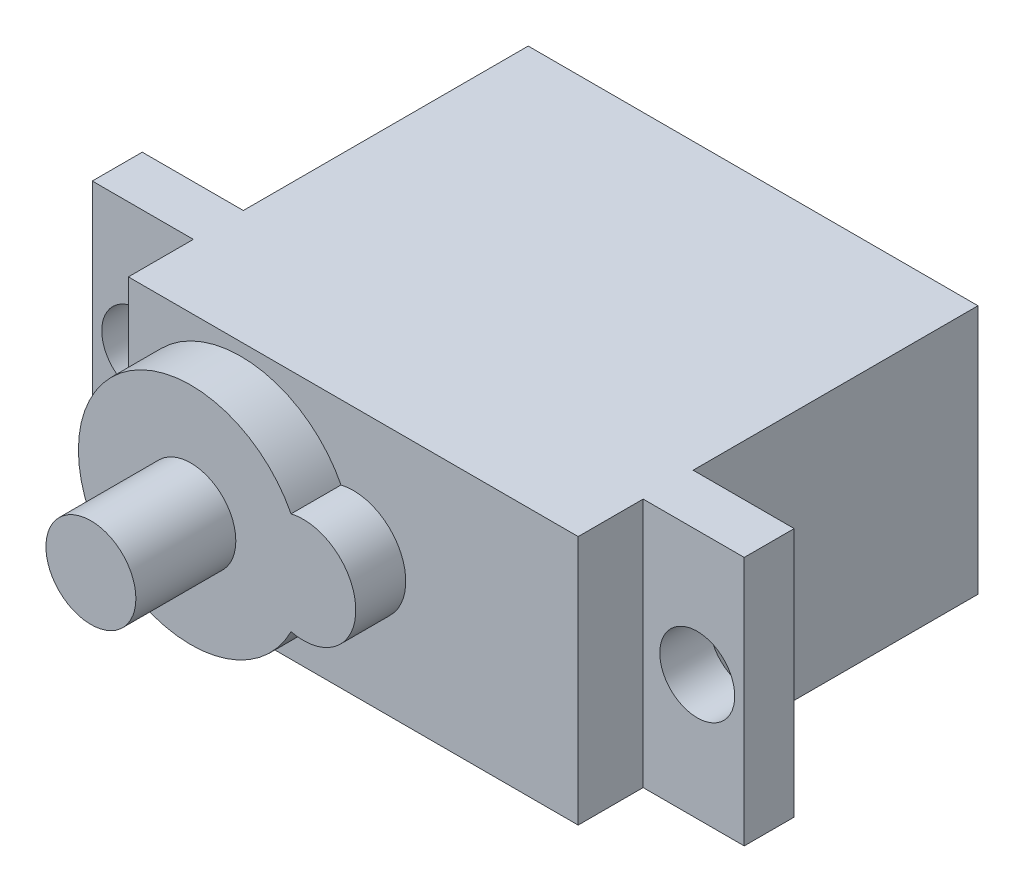
ISO-10303-21;
HEADER;
FILE_DESCRIPTION(('STEP AP214'),'2;1');
FILE_NAME('part.step','',(''),(''),'','','');
FILE_SCHEMA(('AUTOMOTIVE_DESIGN { 1 0 10303 214 1 1 1 1 }'));
ENDSEC;
DATA;
#1=APPLICATION_CONTEXT('core data for automotive mechanical design processes');
#2=APPLICATION_PROTOCOL_DEFINITION('international standard','automotive_design',2000,#1);
#3=PRODUCT_CONTEXT('',#1,'mechanical');
#4=PRODUCT('Part','Part','',(#3));
#5=PRODUCT_RELATED_PRODUCT_CATEGORY('part','',(#4));
#6=PRODUCT_DEFINITION_FORMATION('','',#4);
#7=PRODUCT_DEFINITION_CONTEXT('part definition',#1,'design');
#8=PRODUCT_DEFINITION('design','',#6,#7);
#9=PRODUCT_DEFINITION_SHAPE('','',#8);
#10=(LENGTH_UNIT() NAMED_UNIT(*) SI_UNIT(.MILLI.,.METRE.));
#11=(NAMED_UNIT(*) PLANE_ANGLE_UNIT() SI_UNIT($,.RADIAN.));
#12=(NAMED_UNIT(*) SI_UNIT($,.STERADIAN.) SOLID_ANGLE_UNIT());
#13=UNCERTAINTY_MEASURE_WITH_UNIT(LENGTH_MEASURE(1.E-05),#10,'distance_accuracy_value','');
#14=(GEOMETRIC_REPRESENTATION_CONTEXT(3) GLOBAL_UNCERTAINTY_ASSIGNED_CONTEXT((#13)) GLOBAL_UNIT_ASSIGNED_CONTEXT((#10,
#11,#12)) REPRESENTATION_CONTEXT('',''));
#15=CARTESIAN_POINT('',(0.,0.,0.));
#16=DIRECTION('',(0.,0.,1.));
#17=DIRECTION('',(1.,0.,0.));
#18=AXIS2_PLACEMENT_3D('',#15,#16,#17);
#19=CARTESIAN_POINT('',(-92.7307385808718,0.,-17.018));
#20=DIRECTION('',(-1.,0.,0.));
#21=DIRECTION('',(0.,0.,1.));
#22=AXIS2_PLACEMENT_3D('',#19,#20,#21);
#23=PLANE('',#22);
#24=DIRECTION('',(0.,0.,1.));
#25=VECTOR('',#24,1.);
#26=CARTESIAN_POINT('',(-92.7307385808718,67.2823387554157,-17.018));
#27=LINE('',#26,#25);
#28=CARTESIAN_POINT('',(-92.7307385808718,67.2823387554157,0.));
#29=VERTEX_POINT('',#28);
#30=CARTESIAN_POINT('',(-92.7307385808718,67.2823387554157,3.302));
#31=VERTEX_POINT('',#30);
#32=EDGE_CURVE('E257',#29,#31,#27,.T.);
#33=ORIENTED_EDGE('',*,*,#32,.F.);
#34=DIRECTION('',(0.,-1.,0.));
#35=VECTOR('',#34,1.);
#36=CARTESIAN_POINT('',(-92.7307385808718,0.,0.));
#37=LINE('',#36,#35);
#38=CARTESIAN_POINT('',(-92.7307385808718,54.5823387554157,0.));
#39=VERTEX_POINT('',#38);
#40=EDGE_CURVE('E176',#29,#39,#37,.T.);
#41=ORIENTED_EDGE('',*,*,#40,.T.);
#42=DIRECTION('',(0.,0.,1.));
#43=VECTOR('',#42,1.);
#44=CARTESIAN_POINT('',(-92.7307385808718,54.5823387554157,-17.018));
#45=LINE('',#44,#43);
#46=CARTESIAN_POINT('',(-92.7307385808718,54.5823387554157,3.302));
#47=VERTEX_POINT('',#46);
#48=EDGE_CURVE('E265',#39,#47,#45,.T.);
#49=ORIENTED_EDGE('',*,*,#48,.T.);
#50=DIRECTION('',(0.,-1.,0.));
#51=VECTOR('',#50,1.);
#52=CARTESIAN_POINT('',(-92.7307385808718,0.,3.302));
#53=LINE('',#52,#51);
#54=CARTESIAN_POINT('',(-92.7307385808718,60.9323387554157,3.302));
#55=VERTEX_POINT('',#54);
#56=EDGE_CURVE('E237',#55,#47,#53,.T.);
#57=ORIENTED_EDGE('',*,*,#56,.F.);
#58=EDGE_CURVE('E238',#31,#55,#53,.T.);
#59=ORIENTED_EDGE('',*,*,#58,.F.);
#60=EDGE_LOOP('',(#33,#41,#49,#57,#59));
#61=FACE_BOUND('',#60,.T.);
#62=ADVANCED_FACE('F45',(#61),#23,.T.);
#63=CARTESIAN_POINT('',(-69.8707385808718,0.,-17.018));
#64=DIRECTION('',(-1.,0.,0.));
#65=DIRECTION('',(0.,0.,1.));
#66=AXIS2_PLACEMENT_3D('',#63,#64,#65);
#67=PLANE('',#66);
#68=DIRECTION('',(0.,-1.,0.));
#69=VECTOR('',#68,1.);
#70=CARTESIAN_POINT('',(-69.8707385808718,0.,0.));
#71=LINE('',#70,#69);
#72=CARTESIAN_POINT('',(-69.8707385808718,67.2823387554157,0.));
#73=VERTEX_POINT('',#72);
#74=CARTESIAN_POINT('',(-69.8707385808718,54.5823387554157,0.));
#75=VERTEX_POINT('',#74);
#76=EDGE_CURVE('E219',#73,#75,#71,.T.);
#77=ORIENTED_EDGE('',*,*,#76,.F.);
#78=DIRECTION('',(0.,0.,1.));
#79=VECTOR('',#78,1.);
#80=CARTESIAN_POINT('',(-69.8707385808718,67.2823387554157,-17.018));
#81=LINE('',#80,#79);
#82=CARTESIAN_POINT('',(-69.8707385808718,67.2823387554157,3.302));
#83=VERTEX_POINT('',#82);
#84=EDGE_CURVE('E260',#73,#83,#81,.T.);
#85=ORIENTED_EDGE('',*,*,#84,.T.);
#86=DIRECTION('',(0.,-1.,0.));
#87=VECTOR('',#86,1.);
#88=CARTESIAN_POINT('',(-69.8707385808718,0.,3.302));
#89=LINE('',#88,#87);
#90=CARTESIAN_POINT('',(-69.8707385808718,54.5823387554157,3.302));
#91=VERTEX_POINT('',#90);
#92=EDGE_CURVE('E243',#83,#91,#89,.T.);
#93=ORIENTED_EDGE('',*,*,#92,.T.);
#94=DIRECTION('',(0.,0.,1.));
#95=VECTOR('',#94,1.);
#96=CARTESIAN_POINT('',(-69.8707385808718,54.5823387554157,-17.018));
#97=LINE('',#96,#95);
#98=EDGE_CURVE('E263',#75,#91,#97,.T.);
#99=ORIENTED_EDGE('',*,*,#98,.F.);
#100=EDGE_LOOP('',(#77,#85,#93,#99));
#101=FACE_BOUND('',#100,.T.);
#102=ADVANCED_FACE('F286',(#101),#67,.F.);
#103=CARTESIAN_POINT('',(0.,67.2823387554157,-17.018));
#104=DIRECTION('',(0.,-1.,0.));
#105=DIRECTION('',(0.,0.,-1.));
#106=AXIS2_PLACEMENT_3D('',#103,#104,#105);
#107=PLANE('',#106);
#108=CARTESIAN_POINT('',(-92.7307385808718,67.2823387554157,-17.018));
#109=VERTEX_POINT('',#108);
#110=CARTESIAN_POINT('',(-92.7307385808718,67.2823387554157,-2.54));
#111=VERTEX_POINT('',#110);
#112=EDGE_CURVE('E49',#109,#111,#27,.T.);
#113=ORIENTED_EDGE('',*,*,#112,.T.);
#114=DIRECTION('',(-1.,0.,0.));
#115=VECTOR('',#114,1.);
#116=CARTESIAN_POINT('',(0.,67.2823387554157,-2.54));
#117=LINE('',#116,#115);
#118=CARTESIAN_POINT('',(-97.8676638737466,67.2823387554157,-2.54));
#119=VERTEX_POINT('',#118);
#120=EDGE_CURVE('E175',#111,#119,#117,.T.);
#121=ORIENTED_EDGE('',*,*,#120,.T.);
#122=DIRECTION('',(0.,0.,1.));
#123=VECTOR('',#122,1.);
#124=CARTESIAN_POINT('',(-97.8676638737466,67.2823387554157,-2.54));
#125=LINE('',#124,#123);
#126=CARTESIAN_POINT('',(-97.8676638737466,67.2823387554157,0.));
#127=VERTEX_POINT('',#126);
#128=EDGE_CURVE('E186',#119,#127,#125,.T.);
#129=ORIENTED_EDGE('',*,*,#128,.T.);
#130=DIRECTION('',(-1.,0.,0.));
#131=VECTOR('',#130,1.);
#132=CARTESIAN_POINT('',(0.,67.2823387554157,0.));
#133=LINE('',#132,#131);
#134=EDGE_CURVE('E168',#29,#127,#133,.T.);
#135=ORIENTED_EDGE('',*,*,#134,.F.);
#136=ORIENTED_EDGE('',*,*,#32,.T.);
#137=DIRECTION('',(1.,0.,0.));
#138=VECTOR('',#137,1.);
#139=CARTESIAN_POINT('',(0.,67.2823387554157,3.302));
#140=LINE('',#139,#138);
#141=EDGE_CURVE('E233',#31,#83,#140,.T.);
#142=ORIENTED_EDGE('',*,*,#141,.T.);
#143=ORIENTED_EDGE('',*,*,#84,.F.);
#144=DIRECTION('',(1.,0.,0.));
#145=VECTOR('',#144,1.);
#146=CARTESIAN_POINT('',(0.,67.2823387554157,0.));
#147=LINE('',#146,#145);
#148=CARTESIAN_POINT('',(-64.733813287997,67.2823387554157,0.));
#149=VERTEX_POINT('',#148);
#150=EDGE_CURVE('E199',#73,#149,#147,.T.);
#151=ORIENTED_EDGE('',*,*,#150,.T.);
#152=DIRECTION('',(0.,0.,1.));
#153=VECTOR('',#152,1.);
#154=CARTESIAN_POINT('',(-64.733813287997,67.2823387554157,-2.54));
#155=LINE('',#154,#153);
#156=CARTESIAN_POINT('',(-64.733813287997,67.2823387554157,-2.54));
#157=VERTEX_POINT('',#156);
#158=EDGE_CURVE('E230',#157,#149,#155,.T.);
#159=ORIENTED_EDGE('',*,*,#158,.F.);
#160=DIRECTION('',(1.,0.,0.));
#161=VECTOR('',#160,1.);
#162=CARTESIAN_POINT('',(0.,67.2823387554157,-2.54));
#163=LINE('',#162,#161);
#164=CARTESIAN_POINT('',(-69.8707385808718,67.2823387554157,-2.54));
#165=VERTEX_POINT('',#164);
#166=EDGE_CURVE('E201',#165,#157,#163,.T.);
#167=ORIENTED_EDGE('',*,*,#166,.F.);
#168=CARTESIAN_POINT('',(-69.8707385808718,67.2823387554157,-17.018));
#169=VERTEX_POINT('',#168);
#170=EDGE_CURVE('E54',#169,#165,#81,.T.);
#171=ORIENTED_EDGE('',*,*,#170,.F.);
#172=DIRECTION('',(1.,0.,0.));
#173=VECTOR('',#172,1.);
#174=CARTESIAN_POINT('',(0.,67.2823387554157,-17.018));
#175=LINE('',#174,#173);
#176=EDGE_CURVE('E246',#109,#169,#175,.T.);
#177=ORIENTED_EDGE('',*,*,#176,.F.);
#178=EDGE_LOOP('',(#113,#121,#129,#135,#136,#142,#143,#151,#159,#167,#171,#177));
#179=FACE_BOUND('',#178,.T.);
#180=ADVANCED_FACE('F47',(#179),#107,.F.);
#181=ORIENTED_EDGE('',*,*,#170,.T.);
#182=DIRECTION('',(0.,-1.,0.));
#183=VECTOR('',#182,1.);
#184=CARTESIAN_POINT('',(-69.8707385808718,0.,-2.54));
#185=LINE('',#184,#183);
#186=CARTESIAN_POINT('',(-69.8707385808718,54.5823387554157,-2.54));
#187=VERTEX_POINT('',#186);
#188=EDGE_CURVE('E204',#165,#187,#185,.T.);
#189=ORIENTED_EDGE('',*,*,#188,.T.);
#190=CARTESIAN_POINT('',(-69.8707385808718,54.5823387554157,-17.018));
#191=VERTEX_POINT('',#190);
#192=EDGE_CURVE('E261',#191,#187,#97,.T.);
#193=ORIENTED_EDGE('',*,*,#192,.F.);
#194=DIRECTION('',(0.,-1.,0.));
#195=VECTOR('',#194,1.);
#196=CARTESIAN_POINT('',(-69.8707385808718,0.,-17.018));
#197=LINE('',#196,#195);
#198=EDGE_CURVE('E255',#169,#191,#197,.T.);
#199=ORIENTED_EDGE('',*,*,#198,.F.);
#200=EDGE_LOOP('',(#181,#189,#193,#199));
#201=FACE_BOUND('',#200,.T.);
#202=ADVANCED_FACE('F301',(#201),#67,.F.);
#203=CARTESIAN_POINT('',(0.,54.5823387554157,-17.018));
#204=DIRECTION('',(0.,-1.,0.));
#205=DIRECTION('',(0.,0.,-1.));
#206=AXIS2_PLACEMENT_3D('',#203,#204,#205);
#207=PLANE('',#206);
#208=ORIENTED_EDGE('',*,*,#192,.T.);
#209=DIRECTION('',(1.,0.,0.));
#210=VECTOR('',#209,1.);
#211=CARTESIAN_POINT('',(0.,54.5823387554157,-2.54));
#212=LINE('',#211,#210);
#213=CARTESIAN_POINT('',(-64.733813287997,54.5823387554157,-2.54));
#214=VERTEX_POINT('',#213);
#215=EDGE_CURVE('E208',#187,#214,#212,.T.);
#216=ORIENTED_EDGE('',*,*,#215,.T.);
#217=DIRECTION('',(0.,0.,1.));
#218=VECTOR('',#217,1.);
#219=CARTESIAN_POINT('',(-64.733813287997,54.5823387554157,-2.54));
#220=LINE('',#219,#218);
#221=CARTESIAN_POINT('',(-64.733813287997,54.5823387554157,0.));
#222=VERTEX_POINT('',#221);
#223=EDGE_CURVE('E216',#214,#222,#220,.T.);
#224=ORIENTED_EDGE('',*,*,#223,.T.);
#225=DIRECTION('',(1.,0.,0.));
#226=VECTOR('',#225,1.);
#227=CARTESIAN_POINT('',(0.,54.5823387554157,0.));
#228=LINE('',#227,#226);
#229=EDGE_CURVE('E222',#75,#222,#228,.T.);
#230=ORIENTED_EDGE('',*,*,#229,.F.);
#231=ORIENTED_EDGE('',*,*,#98,.T.);
#232=DIRECTION('',(1.,0.,0.));
#233=VECTOR('',#232,1.);
#234=CARTESIAN_POINT('',(0.,54.5823387554157,3.302));
#235=LINE('',#234,#233);
#236=EDGE_CURVE('E240',#47,#91,#235,.T.);
#237=ORIENTED_EDGE('',*,*,#236,.F.);
#238=ORIENTED_EDGE('',*,*,#48,.F.);
#239=DIRECTION('',(-1.,0.,0.));
#240=VECTOR('',#239,1.);
#241=CARTESIAN_POINT('',(0.,54.5823387554157,0.));
#242=LINE('',#241,#240);
#243=CARTESIAN_POINT('',(-97.8676638737466,54.5823387554157,0.));
#244=VERTEX_POINT('',#243);
#245=EDGE_CURVE('E193',#39,#244,#242,.T.);
#246=ORIENTED_EDGE('',*,*,#245,.T.);
#247=DIRECTION('',(0.,0.,1.));
#248=VECTOR('',#247,1.);
#249=CARTESIAN_POINT('',(-97.8676638737466,54.5823387554157,-2.54));
#250=LINE('',#249,#248);
#251=CARTESIAN_POINT('',(-97.8676638737466,54.5823387554157,-2.54));
#252=VERTEX_POINT('',#251);
#253=EDGE_CURVE('E197',#252,#244,#250,.T.);
#254=ORIENTED_EDGE('',*,*,#253,.F.);
#255=DIRECTION('',(-1.,0.,0.));
#256=VECTOR('',#255,1.);
#257=CARTESIAN_POINT('',(0.,54.5823387554157,-2.54));
#258=LINE('',#257,#256);
#259=CARTESIAN_POINT('',(-92.7307385808718,54.5823387554157,-2.54));
#260=VERTEX_POINT('',#259);
#261=EDGE_CURVE('E182',#260,#252,#258,.T.);
#262=ORIENTED_EDGE('',*,*,#261,.F.);
#263=CARTESIAN_POINT('',(-92.7307385808718,54.5823387554157,-17.018));
#264=VERTEX_POINT('',#263);
#265=EDGE_CURVE('E264',#264,#260,#45,.T.);
#266=ORIENTED_EDGE('',*,*,#265,.F.);
#267=DIRECTION('',(1.,0.,0.));
#268=VECTOR('',#267,1.);
#269=CARTESIAN_POINT('',(0.,54.5823387554157,-17.018));
#270=LINE('',#269,#268);
#271=EDGE_CURVE('E252',#264,#191,#270,.T.);
#272=ORIENTED_EDGE('',*,*,#271,.T.);
#273=EDGE_LOOP('',(#208,#216,#224,#230,#231,#237,#238,#246,#254,#262,#266,#272));
#274=FACE_BOUND('',#273,.T.);
#275=ADVANCED_FACE('F318',(#274),#207,.T.);
#276=DIRECTION('',(0.,-1.,0.));
#277=VECTOR('',#276,1.);
#278=CARTESIAN_POINT('',(-92.7307385808718,0.,-2.54));
#279=LINE('',#278,#277);
#280=EDGE_CURVE('E184',#111,#260,#279,.T.);
#281=ORIENTED_EDGE('',*,*,#280,.F.);
#282=ORIENTED_EDGE('',*,*,#112,.F.);
#283=DIRECTION('',(0.,-1.,0.));
#284=VECTOR('',#283,1.);
#285=CARTESIAN_POINT('',(-92.7307385808718,0.,-17.018));
#286=LINE('',#285,#284);
#287=EDGE_CURVE('E249',#109,#264,#286,.T.);
#288=ORIENTED_EDGE('',*,*,#287,.T.);
#289=ORIENTED_EDGE('',*,*,#265,.T.);
#290=EDGE_LOOP('',(#281,#282,#288,#289));
#291=FACE_BOUND('',#290,.T.);
#292=ADVANCED_FACE('F306',(#291),#23,.T.);
#293=CARTESIAN_POINT('',(0.,0.,-17.018));
#294=DIRECTION('',(0.,0.,1.));
#295=DIRECTION('',(1.,0.,0.));
#296=AXIS2_PLACEMENT_3D('',#293,#294,#295);
#297=PLANE('',#296);
#298=ORIENTED_EDGE('',*,*,#176,.T.);
#299=ORIENTED_EDGE('',*,*,#198,.T.);
#300=ORIENTED_EDGE('',*,*,#271,.F.);
#301=ORIENTED_EDGE('',*,*,#287,.F.);
#302=EDGE_LOOP('',(#298,#299,#300,#301));
#303=FACE_BOUND('',#302,.T.);
#304=ADVANCED_FACE('F305',(#303),#297,.F.);
#305=CARTESIAN_POINT('',(0.,0.,3.302));
#306=DIRECTION('',(0.,0.,1.));
#307=DIRECTION('',(1.,0.,0.));
#308=AXIS2_PLACEMENT_3D('',#305,#306,#307);
#309=PLANE('',#308);
#310=CARTESIAN_POINT('',(-81.3007385808718,60.9323387554157,3.302));
#311=DIRECTION('',(0.,0.,1.));
#312=DIRECTION('',(1.,0.,0.));
#313=AXIS2_PLACEMENT_3D('',#310,#311,#312);
#314=CIRCLE('',#313,2.66699999999999);
#315=CARTESIAN_POINT('',(-81.9230385808718,58.3389564638898,3.302));
#316=VERTEX_POINT('',#315);
#317=CARTESIAN_POINT('',(-81.9230385808718,63.5257210469416,3.302));
#318=VERTEX_POINT('',#317);
#319=EDGE_CURVE('E164',#316,#318,#314,.T.);
#320=ORIENTED_EDGE('',*,*,#319,.F.);
#321=CARTESIAN_POINT('',(-87.0157385808718,60.9323387554157,3.302));
#322=DIRECTION('',(0.,0.,1.));
#323=DIRECTION('',(1.,0.,0.));
#324=AXIS2_PLACEMENT_3D('',#321,#322,#323);
#325=CIRCLE('',#324,5.71499999999999);
#326=EDGE_CURVE('E11',#55,#316,#325,.T.);
#327=ORIENTED_EDGE('',*,*,#326,.F.);
#328=ORIENTED_EDGE('',*,*,#56,.T.);
#329=ORIENTED_EDGE('',*,*,#236,.T.);
#330=ORIENTED_EDGE('',*,*,#92,.F.);
#331=ORIENTED_EDGE('',*,*,#141,.F.);
#332=ORIENTED_EDGE('',*,*,#58,.T.);
#333=EDGE_CURVE('E56',#318,#55,#325,.T.);
#334=ORIENTED_EDGE('',*,*,#333,.F.);
#335=EDGE_LOOP('',(#320,#327,#328,#329,#330,#331,#332,#334));
#336=FACE_BOUND('',#335,.T.);
#337=ADVANCED_FACE('F282',(#336),#309,.T.);
#338=CARTESIAN_POINT('',(-64.733813287997,0.,-2.54));
#339=DIRECTION('',(-1.,0.,0.));
#340=DIRECTION('',(0.,0.,1.));
#341=AXIS2_PLACEMENT_3D('',#338,#339,#340);
#342=PLANE('',#341);
#343=DIRECTION('',(0.,-1.,0.));
#344=VECTOR('',#343,1.);
#345=CARTESIAN_POINT('',(-64.733813287997,0.,0.));
#346=LINE('',#345,#344);
#347=EDGE_CURVE('E225',#149,#222,#346,.T.);
#348=ORIENTED_EDGE('',*,*,#347,.T.);
#349=ORIENTED_EDGE('',*,*,#223,.F.);
#350=DIRECTION('',(0.,-1.,0.));
#351=VECTOR('',#350,1.);
#352=CARTESIAN_POINT('',(-64.733813287997,0.,-2.54));
#353=LINE('',#352,#351);
#354=EDGE_CURVE('E211',#157,#214,#353,.T.);
#355=ORIENTED_EDGE('',*,*,#354,.F.);
#356=ORIENTED_EDGE('',*,*,#158,.T.);
#357=EDGE_LOOP('',(#348,#349,#355,#356));
#358=FACE_BOUND('',#357,.T.);
#359=ADVANCED_FACE('F293',(#358),#342,.F.);
#360=CARTESIAN_POINT('',(-67.1207385808718,60.9323387554157,-2.54));
#361=DIRECTION('',(0.,0.,1.));
#362=DIRECTION('',(1.,0.,0.));
#363=AXIS2_PLACEMENT_3D('',#360,#361,#362);
#364=CYLINDRICAL_SURFACE('',#363,1.90500000000001);
#365=CARTESIAN_POINT('',(-67.1207385808718,60.9323387554157,-2.54));
#366=DIRECTION('',(0.,0.,1.));
#367=DIRECTION('',(1.,0.,0.));
#368=AXIS2_PLACEMENT_3D('',#365,#366,#367);
#369=CIRCLE('',#368,1.90500000000001);
#370=CARTESIAN_POINT('',(-65.2157385808718,60.9323387554157,-2.54));
#371=VERTEX_POINT('',#370);
#372=EDGE_CURVE('E213',#371,#371,#369,.F.);
#373=ORIENTED_EDGE('',*,*,#372,.T.);
#374=EDGE_LOOP('',(#373));
#375=FACE_BOUND('',#374,.T.);
#376=CARTESIAN_POINT('',(-67.1207385808718,60.9323387554157,0.));
#377=DIRECTION('',(0.,0.,1.));
#378=DIRECTION('',(1.,0.,0.));
#379=AXIS2_PLACEMENT_3D('',#376,#377,#378);
#380=CIRCLE('',#379,1.90500000000001);
#381=CARTESIAN_POINT('',(-65.2157385808718,60.9323387554157,0.));
#382=VERTEX_POINT('',#381);
#383=EDGE_CURVE('E205',#382,#382,#380,.F.);
#384=ORIENTED_EDGE('',*,*,#383,.F.);
#385=EDGE_LOOP('',(#384));
#386=FACE_BOUND('',#385,.T.);
#387=ADVANCED_FACE('F341',(#375,#386),#364,.F.);
#388=CARTESIAN_POINT('',(0.,0.,-2.54));
#389=DIRECTION('',(0.,0.,1.));
#390=DIRECTION('',(1.,0.,0.));
#391=AXIS2_PLACEMENT_3D('',#388,#389,#390);
#392=PLANE('',#391);
#393=ORIENTED_EDGE('',*,*,#166,.T.);
#394=ORIENTED_EDGE('',*,*,#354,.T.);
#395=ORIENTED_EDGE('',*,*,#215,.F.);
#396=ORIENTED_EDGE('',*,*,#188,.F.);
#397=EDGE_LOOP('',(#393,#394,#395,#396));
#398=FACE_BOUND('',#397,.T.);
#399=ORIENTED_EDGE('',*,*,#372,.F.);
#400=EDGE_LOOP('',(#399));
#401=FACE_BOUND('',#400,.T.);
#402=ADVANCED_FACE('F296',(#398,#401),#392,.F.);
#403=CARTESIAN_POINT('',(0.,0.,0.));
#404=DIRECTION('',(0.,0.,1.));
#405=DIRECTION('',(1.,0.,0.));
#406=AXIS2_PLACEMENT_3D('',#403,#404,#405);
#407=PLANE('',#406);
#408=ORIENTED_EDGE('',*,*,#150,.F.);
#409=ORIENTED_EDGE('',*,*,#76,.T.);
#410=ORIENTED_EDGE('',*,*,#229,.T.);
#411=ORIENTED_EDGE('',*,*,#347,.F.);
#412=EDGE_LOOP('',(#408,#409,#410,#411));
#413=FACE_BOUND('',#412,.T.);
#414=ORIENTED_EDGE('',*,*,#383,.T.);
#415=EDGE_LOOP('',(#414));
#416=FACE_BOUND('',#415,.T.);
#417=ADVANCED_FACE('F289',(#413,#416),#407,.T.);
#418=CARTESIAN_POINT('',(-95.4807385808718,60.9323387554157,-2.54));
#419=DIRECTION('',(0.,0.,1.));
#420=DIRECTION('',(1.,0.,0.));
#421=AXIS2_PLACEMENT_3D('',#418,#419,#420);
#422=CYLINDRICAL_SURFACE('',#421,1.90500000000001);
#423=CARTESIAN_POINT('',(-95.4807385808718,60.9323387554157,-2.54));
#424=DIRECTION('',(0.,0.,1.));
#425=DIRECTION('',(1.,0.,0.));
#426=AXIS2_PLACEMENT_3D('',#423,#424,#425);
#427=CIRCLE('',#426,1.90500000000001);
#428=CARTESIAN_POINT('',(-93.5757385808718,60.9323387554157,-2.54));
#429=VERTEX_POINT('',#428);
#430=EDGE_CURVE('E172',#429,#429,#427,.T.);
#431=ORIENTED_EDGE('',*,*,#430,.F.);
#432=EDGE_LOOP('',(#431));
#433=FACE_BOUND('',#432,.T.);
#434=CARTESIAN_POINT('',(-95.4807385808718,60.9323387554157,0.));
#435=DIRECTION('',(0.,0.,1.));
#436=DIRECTION('',(1.,0.,0.));
#437=AXIS2_PLACEMENT_3D('',#434,#435,#436);
#438=CIRCLE('',#437,1.90500000000001);
#439=CARTESIAN_POINT('',(-93.5757385808718,60.9323387554157,0.));
#440=VERTEX_POINT('',#439);
#441=EDGE_CURVE('E165',#440,#440,#438,.T.);
#442=ORIENTED_EDGE('',*,*,#441,.T.);
#443=EDGE_LOOP('',(#442));
#444=FACE_BOUND('',#443,.T.);
#445=ADVANCED_FACE('F347',(#433,#444),#422,.F.);
#446=CARTESIAN_POINT('',(-97.8676638737466,0.,-2.54));
#447=DIRECTION('',(-1.,0.,0.));
#448=DIRECTION('',(0.,0.,1.));
#449=AXIS2_PLACEMENT_3D('',#446,#447,#448);
#450=PLANE('',#449);
#451=DIRECTION('',(0.,-1.,0.));
#452=VECTOR('',#451,1.);
#453=CARTESIAN_POINT('',(-97.8676638737466,0.,0.));
#454=LINE('',#453,#452);
#455=EDGE_CURVE('E190',#127,#244,#454,.T.);
#456=ORIENTED_EDGE('',*,*,#455,.F.);
#457=ORIENTED_EDGE('',*,*,#128,.F.);
#458=DIRECTION('',(0.,-1.,0.));
#459=VECTOR('',#458,1.);
#460=CARTESIAN_POINT('',(-97.8676638737466,0.,-2.54));
#461=LINE('',#460,#459);
#462=EDGE_CURVE('E179',#119,#252,#461,.T.);
#463=ORIENTED_EDGE('',*,*,#462,.T.);
#464=ORIENTED_EDGE('',*,*,#253,.T.);
#465=EDGE_LOOP('',(#456,#457,#463,#464));
#466=FACE_BOUND('',#465,.T.);
#467=ADVANCED_FACE('F313',(#466),#450,.T.);
#468=CARTESIAN_POINT('',(0.,0.,-2.54));
#469=DIRECTION('',(0.,0.,1.));
#470=DIRECTION('',(1.,0.,0.));
#471=AXIS2_PLACEMENT_3D('',#468,#469,#470);
#472=PLANE('',#471);
#473=ORIENTED_EDGE('',*,*,#430,.T.);
#474=EDGE_LOOP('',(#473));
#475=FACE_BOUND('',#474,.T.);
#476=ORIENTED_EDGE('',*,*,#120,.F.);
#477=ORIENTED_EDGE('',*,*,#280,.T.);
#478=ORIENTED_EDGE('',*,*,#261,.T.);
#479=ORIENTED_EDGE('',*,*,#462,.F.);
#480=EDGE_LOOP('',(#476,#477,#478,#479));
#481=FACE_BOUND('',#480,.T.);
#482=ADVANCED_FACE('F308',(#475,#481),#472,.F.);
#483=CARTESIAN_POINT('',(0.,0.,0.));
#484=DIRECTION('',(0.,0.,1.));
#485=DIRECTION('',(1.,0.,0.));
#486=AXIS2_PLACEMENT_3D('',#483,#484,#485);
#487=PLANE('',#486);
#488=ORIENTED_EDGE('',*,*,#441,.F.);
#489=EDGE_LOOP('',(#488));
#490=FACE_BOUND('',#489,.T.);
#491=ORIENTED_EDGE('',*,*,#134,.T.);
#492=ORIENTED_EDGE('',*,*,#455,.T.);
#493=ORIENTED_EDGE('',*,*,#245,.F.);
#494=ORIENTED_EDGE('',*,*,#40,.F.);
#495=EDGE_LOOP('',(#491,#492,#493,#494));
#496=FACE_BOUND('',#495,.T.);
#497=ADVANCED_FACE('F316',(#490,#496),#487,.T.);
#498=CARTESIAN_POINT('',(-81.3007385808718,60.9323387554157,5.842));
#499=DIRECTION('',(0.,0.,-1.));
#500=DIRECTION('',(-1.,0.,0.));
#501=AXIS2_PLACEMENT_3D('',#498,#499,#500);
#502=CYLINDRICAL_SURFACE('',#501,2.66699999999999);
#503=ORIENTED_EDGE('',*,*,#319,.T.);
#504=DIRECTION('',(0.,0.,-1.));
#505=VECTOR('',#504,1.);
#506=CARTESIAN_POINT('',(-81.9230385808718,63.5257210469416,5.842));
#507=LINE('',#506,#505);
#508=CARTESIAN_POINT('',(-81.9230385808718,63.5257210469416,5.842));
#509=VERTEX_POINT('',#508);
#510=EDGE_CURVE('E152',#509,#318,#507,.T.);
#511=ORIENTED_EDGE('',*,*,#510,.F.);
#512=CARTESIAN_POINT('',(-81.3007385808718,60.9323387554157,5.842));
#513=DIRECTION('',(0.,0.,1.));
#514=DIRECTION('',(1.,0.,0.));
#515=AXIS2_PLACEMENT_3D('',#512,#513,#514);
#516=CIRCLE('',#515,2.66699999999999);
#517=CARTESIAN_POINT('',(-81.9230385808718,58.3389564638898,5.842));
#518=VERTEX_POINT('',#517);
#519=EDGE_CURVE('E158',#518,#509,#516,.T.);
#520=ORIENTED_EDGE('',*,*,#519,.F.);
#521=DIRECTION('',(0.,0.,-1.));
#522=VECTOR('',#521,1.);
#523=CARTESIAN_POINT('',(-81.9230385808718,58.3389564638898,5.842));
#524=LINE('',#523,#522);
#525=EDGE_CURVE('E155',#518,#316,#524,.T.);
#526=ORIENTED_EDGE('',*,*,#525,.T.);
#527=EDGE_LOOP('',(#503,#511,#520,#526));
#528=FACE_BOUND('',#527,.T.);
#529=ADVANCED_FACE('F163',(#528),#502,.T.);
#530=CARTESIAN_POINT('',(-87.0157385808718,60.9323387554157,5.842));
#531=DIRECTION('',(0.,0.,-1.));
#532=DIRECTION('',(-1.,0.,0.));
#533=AXIS2_PLACEMENT_3D('',#530,#531,#532);
#534=CYLINDRICAL_SURFACE('',#533,5.71499999999999);
#535=ORIENTED_EDGE('',*,*,#333,.T.);
#536=ORIENTED_EDGE('',*,*,#326,.T.);
#537=ORIENTED_EDGE('',*,*,#525,.F.);
#538=CARTESIAN_POINT('',(-87.0157385808718,60.9323387554157,5.842));
#539=DIRECTION('',(0.,0.,1.));
#540=DIRECTION('',(1.,0.,0.));
#541=AXIS2_PLACEMENT_3D('',#538,#539,#540);
#542=CIRCLE('',#541,5.71499999999999);
#543=EDGE_CURVE('E148',#509,#518,#542,.T.);
#544=ORIENTED_EDGE('',*,*,#543,.F.);
#545=ORIENTED_EDGE('',*,*,#510,.T.);
#546=EDGE_LOOP('',(#535,#536,#537,#544,#545));
#547=FACE_BOUND('',#546,.T.);
#548=ADVANCED_FACE('F150',(#547),#534,.T.);
#549=CARTESIAN_POINT('',(-84.1582385808718,60.9323387554157,5.842));
#550=DIRECTION('',(0.,0.,1.));
#551=DIRECTION('',(1.,0.,0.));
#552=AXIS2_PLACEMENT_3D('',#549,#550,#551);
#553=PLANE('',#552);
#554=CARTESIAN_POINT('',(-87.0157385808718,60.9323387554157,5.842));
#555=DIRECTION('',(0.,0.,1.));
#556=DIRECTION('',(1.,0.,0.));
#557=AXIS2_PLACEMENT_3D('',#554,#555,#556);
#558=CIRCLE('',#557,2.28599999999999);
#559=CARTESIAN_POINT('',(-84.7297385808718,60.9323387554157,5.842));
#560=VERTEX_POINT('',#559);
#561=EDGE_CURVE('E379',#560,#560,#558,.T.);
#562=ORIENTED_EDGE('',*,*,#561,.F.);
#563=EDGE_LOOP('',(#562));
#564=FACE_BOUND('',#563,.T.);
#565=ORIENTED_EDGE('',*,*,#519,.T.);
#566=ORIENTED_EDGE('',*,*,#543,.T.);
#567=EDGE_LOOP('',(#565,#566));
#568=FACE_BOUND('',#567,.T.);
#569=ADVANCED_FACE('F160',(#564,#568),#553,.T.);
#570=CARTESIAN_POINT('',(-87.0157385808718,60.9323387554157,10.922));
#571=DIRECTION('',(0.,0.,-1.));
#572=DIRECTION('',(-1.,0.,0.));
#573=AXIS2_PLACEMENT_3D('',#570,#571,#572);
#574=CYLINDRICAL_SURFACE('',#573,2.28599999999999);
#575=CARTESIAN_POINT('',(-87.0157385808718,60.9323387554157,10.922));
#576=DIRECTION('',(0.,0.,1.));
#577=DIRECTION('',(1.,0.,0.));
#578=AXIS2_PLACEMENT_3D('',#575,#576,#577);
#579=CIRCLE('',#578,2.28599999999999);
#580=CARTESIAN_POINT('',(-84.7297385808718,60.9323387554157,10.922));
#581=VERTEX_POINT('',#580);
#582=EDGE_CURVE('E378',#581,#581,#579,.T.);
#583=ORIENTED_EDGE('',*,*,#582,.F.);
#584=EDGE_LOOP('',(#583));
#585=FACE_BOUND('',#584,.T.);
#586=ORIENTED_EDGE('',*,*,#561,.T.);
#587=EDGE_LOOP('',(#586));
#588=FACE_BOUND('',#587,.T.);
#589=ADVANCED_FACE('F366',(#585,#588),#574,.T.);
#590=CARTESIAN_POINT('',(-87.0157385808718,60.9323387554157,10.922));
#591=DIRECTION('',(0.,0.,1.));
#592=DIRECTION('',(1.,0.,0.));
#593=AXIS2_PLACEMENT_3D('',#590,#591,#592);
#594=PLANE('',#593);
#595=ORIENTED_EDGE('',*,*,#582,.T.);
#596=EDGE_LOOP('',(#595));
#597=FACE_BOUND('',#596,.T.);
#598=ADVANCED_FACE('F370',(#597),#594,.T.);
#599=CLOSED_SHELL('',(#62,#102,#180,#202,#275,#292,#304,#337,#359,#387,#402,#417,#445,#467,#482,
#497,#529,#548,#569,#589,#598));
#600=MANIFOLD_SOLID_BREP('B2',#599);
#601=ADVANCED_BREP_SHAPE_REPRESENTATION('',(#18,#600),#14);
#602=SHAPE_DEFINITION_REPRESENTATION(#9,#601);
ENDSEC;
END-ISO-10303-21;
